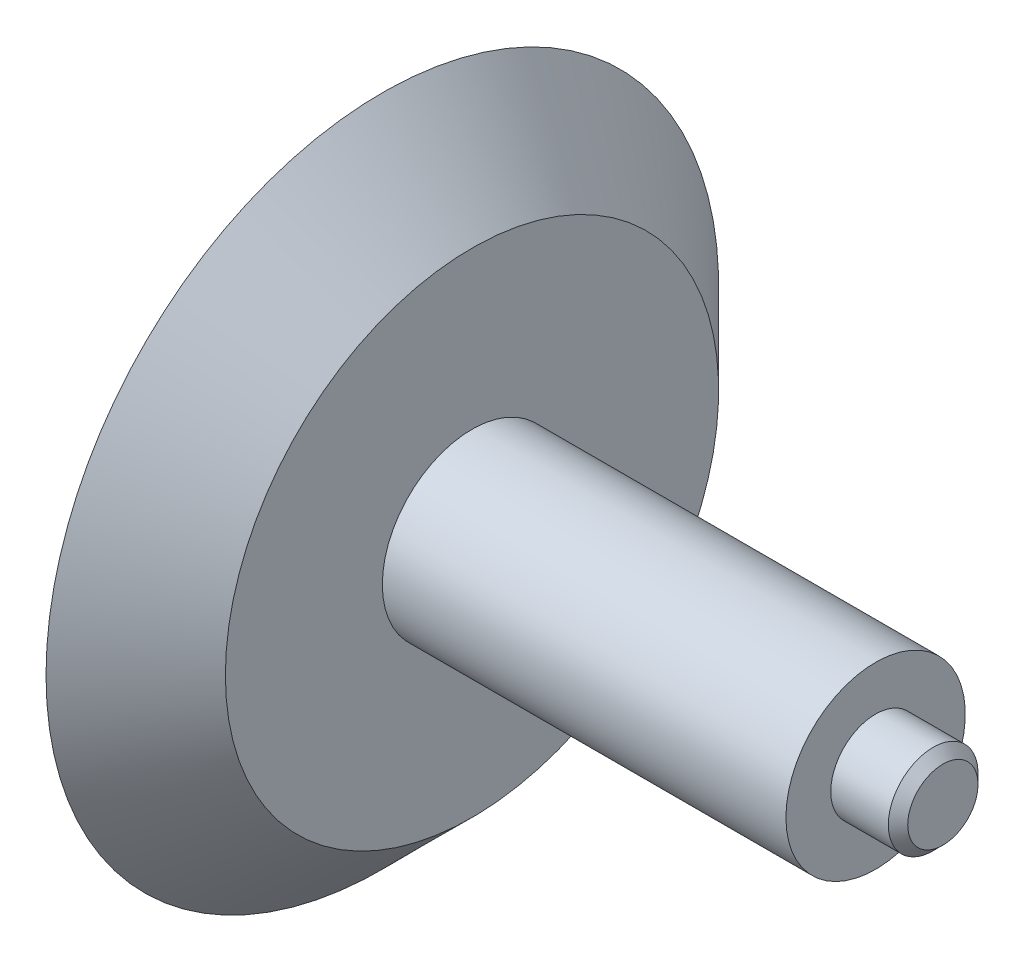
ISO-10303-21;
HEADER;
FILE_DESCRIPTION(('STEP AP214'),'2;1');
FILE_NAME('part.step','',(''),(''),'','','');
FILE_SCHEMA(('AUTOMOTIVE_DESIGN { 1 0 10303 214 1 1 1 1 }'));
ENDSEC;
DATA;
#1=APPLICATION_CONTEXT('core data for automotive mechanical design processes');
#2=APPLICATION_PROTOCOL_DEFINITION('international standard','automotive_design',2000,#1);
#3=PRODUCT_CONTEXT('',#1,'mechanical');
#4=PRODUCT('Part','Part','',(#3));
#5=PRODUCT_RELATED_PRODUCT_CATEGORY('part','',(#4));
#6=PRODUCT_DEFINITION_FORMATION('','',#4);
#7=PRODUCT_DEFINITION_CONTEXT('part definition',#1,'design');
#8=PRODUCT_DEFINITION('design','',#6,#7);
#9=PRODUCT_DEFINITION_SHAPE('','',#8);
#10=(LENGTH_UNIT() NAMED_UNIT(*) SI_UNIT(.MILLI.,.METRE.));
#11=(NAMED_UNIT(*) PLANE_ANGLE_UNIT() SI_UNIT($,.RADIAN.));
#12=(NAMED_UNIT(*) SI_UNIT($,.STERADIAN.) SOLID_ANGLE_UNIT());
#13=UNCERTAINTY_MEASURE_WITH_UNIT(LENGTH_MEASURE(1.E-05),#10,'distance_accuracy_value','');
#14=(GEOMETRIC_REPRESENTATION_CONTEXT(3) GLOBAL_UNCERTAINTY_ASSIGNED_CONTEXT((#13)) GLOBAL_UNIT_ASSIGNED_CONTEXT((#10,
#11,#12)) REPRESENTATION_CONTEXT('',''));
#15=CARTESIAN_POINT('',(0.,0.,0.));
#16=DIRECTION('',(0.,0.,1.));
#17=DIRECTION('',(1.,0.,0.));
#18=AXIS2_PLACEMENT_3D('',#15,#16,#17);
#19=CARTESIAN_POINT('',(0.,0.,0.));
#20=DIRECTION('',(1.,0.,0.));
#21=DIRECTION('',(0.,0.,-1.));
#22=AXIS2_PLACEMENT_3D('',#19,#20,#21);
#23=PLANE('',#22);
#24=CARTESIAN_POINT('',(0.,0.,0.));
#25=DIRECTION('',(-1.,0.,0.));
#26=DIRECTION('',(0.,0.,1.));
#27=AXIS2_PLACEMENT_3D('',#24,#25,#26);
#28=CIRCLE('',#27,7.5);
#29=CARTESIAN_POINT('',(0.,0.,7.5));
#30=VERTEX_POINT('',#29);
#31=EDGE_CURVE('E10',#30,#30,#28,.T.);
#32=ORIENTED_EDGE('',*,*,#31,.T.);
#33=EDGE_LOOP('',(#32));
#34=FACE_BOUND('',#33,.T.);
#35=ADVANCED_FACE('F41',(#34),#23,.F.);
#36=CARTESIAN_POINT('',(2.,0.,0.));
#37=DIRECTION('',(-1.,0.,0.));
#38=DIRECTION('',(0.,0.,1.));
#39=AXIS2_PLACEMENT_3D('',#36,#37,#38);
#40=CONICAL_SURFACE('',#39,5.49999999999998,0.785398163397453);
#41=ORIENTED_EDGE('',*,*,#31,.F.);
#42=EDGE_LOOP('',(#41));
#43=FACE_BOUND('',#42,.T.);
#44=CARTESIAN_POINT('',(2.,0.,0.));
#45=DIRECTION('',(-1.,0.,0.));
#46=DIRECTION('',(0.,0.,1.));
#47=AXIS2_PLACEMENT_3D('',#44,#45,#46);
#48=CIRCLE('',#47,5.49999999999998);
#49=CARTESIAN_POINT('',(2.,0.,5.49999999999998));
#50=VERTEX_POINT('',#49);
#51=EDGE_CURVE('E47',#50,#50,#48,.T.);
#52=ORIENTED_EDGE('',*,*,#51,.T.);
#53=EDGE_LOOP('',(#52));
#54=FACE_BOUND('',#53,.T.);
#55=ADVANCED_FACE('F84',(#43,#54),#40,.T.);
#56=CARTESIAN_POINT('',(2.,5.49999999999998,0.));
#57=DIRECTION('',(-1.,0.,0.));
#58=DIRECTION('',(0.,0.,1.));
#59=AXIS2_PLACEMENT_3D('',#56,#57,#58);
#60=PLANE('',#59);
#61=ORIENTED_EDGE('',*,*,#51,.F.);
#62=EDGE_LOOP('',(#61));
#63=FACE_BOUND('',#62,.T.);
#64=CARTESIAN_POINT('',(2.,0.,0.));
#65=DIRECTION('',(-1.,0.,0.));
#66=DIRECTION('',(0.,0.,1.));
#67=AXIS2_PLACEMENT_3D('',#64,#65,#66);
#68=CIRCLE('',#67,2.);
#69=CARTESIAN_POINT('',(2.,0.,2.));
#70=VERTEX_POINT('',#69);
#71=EDGE_CURVE('E51',#70,#70,#68,.T.);
#72=ORIENTED_EDGE('',*,*,#71,.T.);
#73=EDGE_LOOP('',(#72));
#74=FACE_BOUND('',#73,.T.);
#75=ADVANCED_FACE('F88',(#63,#74),#60,.F.);
#76=CARTESIAN_POINT('',(0.,0.,0.));
#77=DIRECTION('',(-1.,0.,0.));
#78=DIRECTION('',(0.,0.,1.));
#79=AXIS2_PLACEMENT_3D('',#76,#77,#78);
#80=CYLINDRICAL_SURFACE('',#79,2.);
#81=ORIENTED_EDGE('',*,*,#71,.F.);
#82=EDGE_LOOP('',(#81));
#83=FACE_BOUND('',#82,.T.);
#84=CARTESIAN_POINT('',(11.,0.,0.));
#85=DIRECTION('',(-1.,0.,0.));
#86=DIRECTION('',(0.,0.,1.));
#87=AXIS2_PLACEMENT_3D('',#84,#85,#86);
#88=CIRCLE('',#87,2.);
#89=CARTESIAN_POINT('',(11.,0.,2.));
#90=VERTEX_POINT('',#89);
#91=EDGE_CURVE('E55',#90,#90,#88,.T.);
#92=ORIENTED_EDGE('',*,*,#91,.T.);
#93=EDGE_LOOP('',(#92));
#94=FACE_BOUND('',#93,.T.);
#95=ADVANCED_FACE('F93',(#83,#94),#80,.T.);
#96=CARTESIAN_POINT('',(11.,2.,0.));
#97=DIRECTION('',(-1.,0.,0.));
#98=DIRECTION('',(0.,0.,1.));
#99=AXIS2_PLACEMENT_3D('',#96,#97,#98);
#100=PLANE('',#99);
#101=ORIENTED_EDGE('',*,*,#91,.F.);
#102=EDGE_LOOP('',(#101));
#103=FACE_BOUND('',#102,.T.);
#104=CARTESIAN_POINT('',(11.,0.,0.));
#105=DIRECTION('',(-1.,0.,0.));
#106=DIRECTION('',(0.,0.,1.));
#107=AXIS2_PLACEMENT_3D('',#104,#105,#106);
#108=CIRCLE('',#107,1.);
#109=CARTESIAN_POINT('',(11.,0.,1.));
#110=VERTEX_POINT('',#109);
#111=EDGE_CURVE('E60',#110,#110,#108,.T.);
#112=ORIENTED_EDGE('',*,*,#111,.T.);
#113=EDGE_LOOP('',(#112));
#114=FACE_BOUND('',#113,.T.);
#115=ADVANCED_FACE('F99',(#103,#114),#100,.F.);
#116=CARTESIAN_POINT('',(0.,0.,0.));
#117=DIRECTION('',(-1.,0.,0.));
#118=DIRECTION('',(0.,0.,1.));
#119=AXIS2_PLACEMENT_3D('',#116,#117,#118);
#120=CYLINDRICAL_SURFACE('',#119,1.);
#121=CARTESIAN_POINT('',(12.2835,0.,0.));
#122=DIRECTION('',(-1.,0.,0.));
#123=DIRECTION('',(0.,0.,1.));
#124=AXIS2_PLACEMENT_3D('',#121,#122,#123);
#125=CIRCLE('',#124,1.);
#126=CARTESIAN_POINT('',(12.2835,0.,1.));
#127=VERTEX_POINT('',#126);
#128=EDGE_CURVE('E63',#127,#127,#125,.T.);
#129=ORIENTED_EDGE('',*,*,#128,.T.);
#130=EDGE_LOOP('',(#129));
#131=FACE_BOUND('',#130,.T.);
#132=ORIENTED_EDGE('',*,*,#111,.F.);
#133=EDGE_LOOP('',(#132));
#134=FACE_BOUND('',#133,.T.);
#135=ADVANCED_FACE('F79',(#131,#134),#120,.T.);
#136=CARTESIAN_POINT('',(12.5,0.,0.));
#137=DIRECTION('',(-1.,0.,0.));
#138=DIRECTION('',(0.,0.,1.));
#139=AXIS2_PLACEMENT_3D('',#136,#137,#138);
#140=CONICAL_SURFACE('',#139,0.7835,0.785398163397463);
#141=ORIENTED_EDGE('',*,*,#128,.F.);
#142=EDGE_LOOP('',(#141));
#143=FACE_BOUND('',#142,.T.);
#144=CARTESIAN_POINT('',(12.5,0.,0.));
#145=DIRECTION('',(-1.,0.,0.));
#146=DIRECTION('',(0.,0.,1.));
#147=AXIS2_PLACEMENT_3D('',#144,#145,#146);
#148=CIRCLE('',#147,0.7835);
#149=CARTESIAN_POINT('',(12.5,0.,0.7835));
#150=VERTEX_POINT('',#149);
#151=EDGE_CURVE('E66',#150,#150,#148,.T.);
#152=ORIENTED_EDGE('',*,*,#151,.T.);
#153=EDGE_LOOP('',(#152));
#154=FACE_BOUND('',#153,.T.);
#155=ADVANCED_FACE('F70',(#143,#154),#140,.T.);
#156=CARTESIAN_POINT('',(12.5,1.,0.));
#157=DIRECTION('',(-1.,0.,0.));
#158=DIRECTION('',(0.,0.,1.));
#159=AXIS2_PLACEMENT_3D('',#156,#157,#158);
#160=PLANE('',#159);
#161=ORIENTED_EDGE('',*,*,#151,.F.);
#162=EDGE_LOOP('',(#161));
#163=FACE_BOUND('',#162,.T.);
#164=ADVANCED_FACE('F72',(#163),#160,.F.);
#165=CLOSED_SHELL('',(#35,#55,#75,#95,#115,#135,#155,#164));
#166=MANIFOLD_SOLID_BREP('B2',#165);
#167=ADVANCED_BREP_SHAPE_REPRESENTATION('',(#18,#166),#14);
#168=SHAPE_DEFINITION_REPRESENTATION(#9,#167);
ENDSEC;
END-ISO-10303-21;
